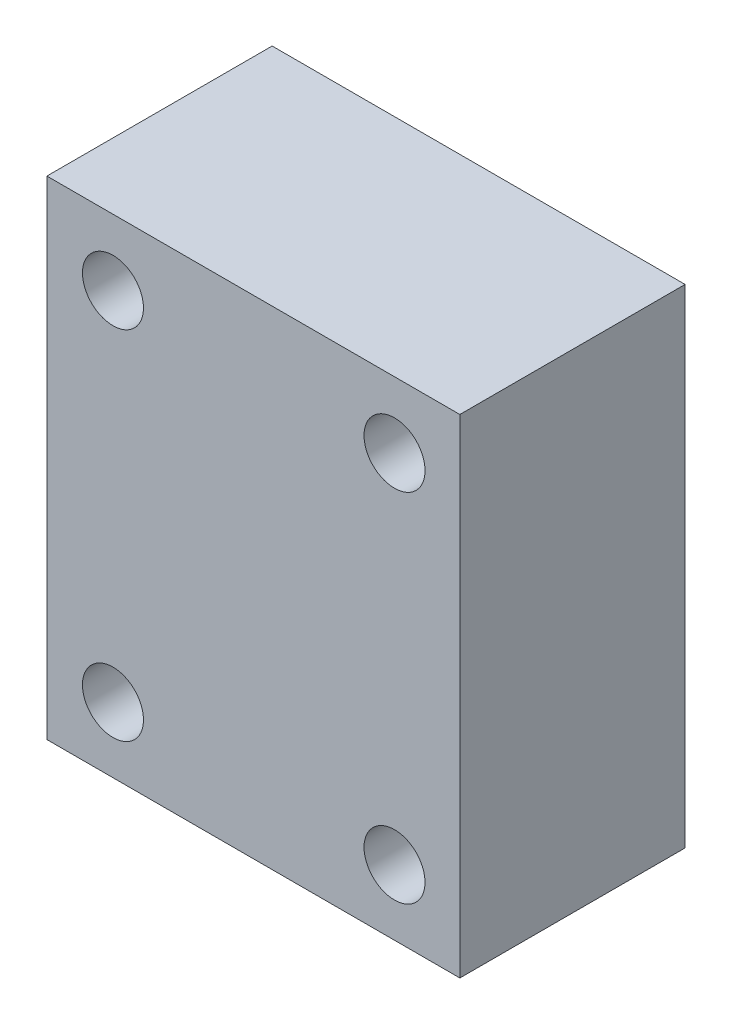
ISO-10303-21;
HEADER;
FILE_DESCRIPTION(('STEP AP214'),'2;1');
FILE_NAME('part.step','',(''),(''),'','','');
FILE_SCHEMA(('AUTOMOTIVE_DESIGN { 1 0 10303 214 1 1 1 1 }'));
ENDSEC;
DATA;
#1=APPLICATION_CONTEXT('core data for automotive mechanical design processes');
#2=APPLICATION_PROTOCOL_DEFINITION('international standard','automotive_design',2000,#1);
#3=PRODUCT_CONTEXT('',#1,'mechanical');
#4=PRODUCT('Part','Part','',(#3));
#5=PRODUCT_RELATED_PRODUCT_CATEGORY('part','',(#4));
#6=PRODUCT_DEFINITION_FORMATION('','',#4);
#7=PRODUCT_DEFINITION_CONTEXT('part definition',#1,'design');
#8=PRODUCT_DEFINITION('design','',#6,#7);
#9=PRODUCT_DEFINITION_SHAPE('','',#8);
#10=(LENGTH_UNIT() NAMED_UNIT(*) SI_UNIT(.MILLI.,.METRE.));
#11=(NAMED_UNIT(*) PLANE_ANGLE_UNIT() SI_UNIT($,.RADIAN.));
#12=(NAMED_UNIT(*) SI_UNIT($,.STERADIAN.) SOLID_ANGLE_UNIT());
#13=UNCERTAINTY_MEASURE_WITH_UNIT(LENGTH_MEASURE(1.E-05),#10,'distance_accuracy_value','');
#14=(GEOMETRIC_REPRESENTATION_CONTEXT(3) GLOBAL_UNCERTAINTY_ASSIGNED_CONTEXT((#13)) GLOBAL_UNIT_ASSIGNED_CONTEXT((#10,
#11,#12)) REPRESENTATION_CONTEXT('',''));
#15=CARTESIAN_POINT('',(0.,0.,0.));
#16=DIRECTION('',(0.,0.,1.));
#17=DIRECTION('',(1.,0.,0.));
#18=AXIS2_PLACEMENT_3D('',#15,#16,#17);
#19=CARTESIAN_POINT('',(34.925,41.275,19.05));
#20=DIRECTION('',(0.,-1.,0.));
#21=DIRECTION('',(0.,0.,-1.));
#22=AXIS2_PLACEMENT_3D('',#19,#20,#21);
#23=PLANE('',#22);
#24=DIRECTION('',(-1.,0.,0.));
#25=VECTOR('',#24,1.);
#26=CARTESIAN_POINT('',(34.925,41.275,-19.05));
#27=LINE('',#26,#25);
#28=CARTESIAN_POINT('',(34.925,41.275,-19.05));
#29=VERTEX_POINT('',#28);
#30=CARTESIAN_POINT('',(-34.925,41.275,-19.05));
#31=VERTEX_POINT('',#30);
#32=EDGE_CURVE('E109',#29,#31,#27,.T.);
#33=ORIENTED_EDGE('',*,*,#32,.T.);
#34=DIRECTION('',(0.,0.,-1.));
#35=VECTOR('',#34,1.);
#36=CARTESIAN_POINT('',(-34.925,41.275,19.05));
#37=LINE('',#36,#35);
#38=CARTESIAN_POINT('',(-34.925,41.275,19.05));
#39=VERTEX_POINT('',#38);
#40=EDGE_CURVE('E11',#39,#31,#37,.T.);
#41=ORIENTED_EDGE('',*,*,#40,.F.);
#42=DIRECTION('',(-1.,0.,0.));
#43=VECTOR('',#42,1.);
#44=CARTESIAN_POINT('',(34.925,41.275,19.05));
#45=LINE('',#44,#43);
#46=CARTESIAN_POINT('',(34.925,41.275,19.05));
#47=VERTEX_POINT('',#46);
#48=EDGE_CURVE('E96',#47,#39,#45,.T.);
#49=ORIENTED_EDGE('',*,*,#48,.F.);
#50=DIRECTION('',(0.,0.,-1.));
#51=VECTOR('',#50,1.);
#52=CARTESIAN_POINT('',(34.925,41.275,19.05));
#53=LINE('',#52,#51);
#54=EDGE_CURVE('E105',#47,#29,#53,.T.);
#55=ORIENTED_EDGE('',*,*,#54,.T.);
#56=EDGE_LOOP('',(#33,#41,#49,#55));
#57=FACE_BOUND('',#56,.T.);
#58=ADVANCED_FACE('F43',(#57),#23,.F.);
#59=CARTESIAN_POINT('',(-34.925,-41.275,19.05));
#60=DIRECTION('',(1.,0.,0.));
#61=DIRECTION('',(0.,0.,-1.));
#62=AXIS2_PLACEMENT_3D('',#59,#60,#61);
#63=PLANE('',#62);
#64=DIRECTION('',(0.,-1.,0.));
#65=VECTOR('',#64,1.);
#66=CARTESIAN_POINT('',(-34.925,-41.275,-19.05));
#67=LINE('',#66,#65);
#68=CARTESIAN_POINT('',(-34.925,-41.275,-19.05));
#69=VERTEX_POINT('',#68);
#70=EDGE_CURVE('E100',#31,#69,#67,.T.);
#71=ORIENTED_EDGE('',*,*,#70,.T.);
#72=DIRECTION('',(0.,0.,-1.));
#73=VECTOR('',#72,1.);
#74=CARTESIAN_POINT('',(-34.925,-41.275,19.05));
#75=LINE('',#74,#73);
#76=CARTESIAN_POINT('',(-34.925,-41.275,19.05));
#77=VERTEX_POINT('',#76);
#78=EDGE_CURVE('E52',#77,#69,#75,.T.);
#79=ORIENTED_EDGE('',*,*,#78,.F.);
#80=DIRECTION('',(0.,-1.,0.));
#81=VECTOR('',#80,1.);
#82=CARTESIAN_POINT('',(-34.925,-41.275,19.05));
#83=LINE('',#82,#81);
#84=EDGE_CURVE('E91',#39,#77,#83,.T.);
#85=ORIENTED_EDGE('',*,*,#84,.F.);
#86=ORIENTED_EDGE('',*,*,#40,.T.);
#87=EDGE_LOOP('',(#71,#79,#85,#86));
#88=FACE_BOUND('',#87,.T.);
#89=ADVANCED_FACE('F99',(#88),#63,.F.);
#90=CARTESIAN_POINT('',(34.925,-41.275,19.05));
#91=DIRECTION('',(0.,1.,0.));
#92=DIRECTION('',(0.,0.,1.));
#93=AXIS2_PLACEMENT_3D('',#90,#91,#92);
#94=PLANE('',#93);
#95=DIRECTION('',(1.,0.,0.));
#96=VECTOR('',#95,1.);
#97=CARTESIAN_POINT('',(34.925,-41.275,-19.05));
#98=LINE('',#97,#96);
#99=CARTESIAN_POINT('',(34.925,-41.275,-19.05));
#100=VERTEX_POINT('',#99);
#101=EDGE_CURVE('E78',#69,#100,#98,.T.);
#102=ORIENTED_EDGE('',*,*,#101,.T.);
#103=DIRECTION('',(0.,0.,-1.));
#104=VECTOR('',#103,1.);
#105=CARTESIAN_POINT('',(34.925,-41.275,19.05));
#106=LINE('',#105,#104);
#107=CARTESIAN_POINT('',(34.925,-41.275,19.05));
#108=VERTEX_POINT('',#107);
#109=EDGE_CURVE('E101',#108,#100,#106,.T.);
#110=ORIENTED_EDGE('',*,*,#109,.F.);
#111=DIRECTION('',(1.,0.,0.));
#112=VECTOR('',#111,1.);
#113=CARTESIAN_POINT('',(34.925,-41.275,19.05));
#114=LINE('',#113,#112);
#115=EDGE_CURVE('E94',#77,#108,#114,.T.);
#116=ORIENTED_EDGE('',*,*,#115,.F.);
#117=ORIENTED_EDGE('',*,*,#78,.T.);
#118=EDGE_LOOP('',(#102,#110,#116,#117));
#119=FACE_BOUND('',#118,.T.);
#120=ADVANCED_FACE('F103',(#119),#94,.F.);
#121=CARTESIAN_POINT('',(34.925,-41.275,19.05));
#122=DIRECTION('',(-1.,0.,0.));
#123=DIRECTION('',(0.,0.,1.));
#124=AXIS2_PLACEMENT_3D('',#121,#122,#123);
#125=PLANE('',#124);
#126=DIRECTION('',(0.,1.,0.));
#127=VECTOR('',#126,1.);
#128=CARTESIAN_POINT('',(34.925,-41.275,-19.05));
#129=LINE('',#128,#127);
#130=EDGE_CURVE('E84',#100,#29,#129,.T.);
#131=ORIENTED_EDGE('',*,*,#130,.T.);
#132=ORIENTED_EDGE('',*,*,#54,.F.);
#133=DIRECTION('',(0.,1.,0.));
#134=VECTOR('',#133,1.);
#135=CARTESIAN_POINT('',(34.925,-41.275,19.05));
#136=LINE('',#135,#134);
#137=EDGE_CURVE('E61',#108,#47,#136,.T.);
#138=ORIENTED_EDGE('',*,*,#137,.F.);
#139=ORIENTED_EDGE('',*,*,#109,.T.);
#140=EDGE_LOOP('',(#131,#132,#138,#139));
#141=FACE_BOUND('',#140,.T.);
#142=ADVANCED_FACE('F187',(#141),#125,.F.);
#143=CARTESIAN_POINT('',(0.,0.,19.05));
#144=DIRECTION('',(0.,0.,-1.));
#145=DIRECTION('',(-1.,0.,0.));
#146=AXIS2_PLACEMENT_3D('',#143,#144,#145);
#147=PLANE('',#146);
#148=CARTESIAN_POINT('',(23.876,30.099,19.05));
#149=DIRECTION('',(0.,0.,-1.));
#150=DIRECTION('',(-1.,0.,0.));
#151=AXIS2_PLACEMENT_3D('',#148,#149,#150);
#152=CIRCLE('',#151,5.159375);
#153=CARTESIAN_POINT('',(18.716625,30.099,19.05));
#154=VERTEX_POINT('',#153);
#155=EDGE_CURVE('E141',#154,#154,#152,.T.);
#156=ORIENTED_EDGE('',*,*,#155,.T.);
#157=EDGE_LOOP('',(#156));
#158=FACE_BOUND('',#157,.T.);
#159=CARTESIAN_POINT('',(-23.749,-30.226,19.05));
#160=DIRECTION('',(0.,0.,-1.));
#161=DIRECTION('',(-1.,0.,0.));
#162=AXIS2_PLACEMENT_3D('',#159,#160,#161);
#163=CIRCLE('',#162,5.159375);
#164=CARTESIAN_POINT('',(-28.908375,-30.226,19.05));
#165=VERTEX_POINT('',#164);
#166=EDGE_CURVE('E144',#165,#165,#163,.T.);
#167=ORIENTED_EDGE('',*,*,#166,.T.);
#168=EDGE_LOOP('',(#167));
#169=FACE_BOUND('',#168,.T.);
#170=CARTESIAN_POINT('',(-23.749,30.099,19.05));
#171=DIRECTION('',(0.,0.,-1.));
#172=DIRECTION('',(-1.,0.,0.));
#173=AXIS2_PLACEMENT_3D('',#170,#171,#172);
#174=CIRCLE('',#173,5.159375);
#175=CARTESIAN_POINT('',(-28.908375,30.099,19.05));
#176=VERTEX_POINT('',#175);
#177=EDGE_CURVE('E150',#176,#176,#174,.T.);
#178=ORIENTED_EDGE('',*,*,#177,.T.);
#179=EDGE_LOOP('',(#178));
#180=FACE_BOUND('',#179,.T.);
#181=CARTESIAN_POINT('',(23.876,-30.226,19.05));
#182=DIRECTION('',(0.,0.,-1.));
#183=DIRECTION('',(-1.,0.,0.));
#184=AXIS2_PLACEMENT_3D('',#181,#182,#183);
#185=CIRCLE('',#184,5.159375);
#186=CARTESIAN_POINT('',(18.716625,-30.226,19.05));
#187=VERTEX_POINT('',#186);
#188=EDGE_CURVE('E140',#187,#187,#185,.T.);
#189=ORIENTED_EDGE('',*,*,#188,.T.);
#190=EDGE_LOOP('',(#189));
#191=FACE_BOUND('',#190,.T.);
#192=ORIENTED_EDGE('',*,*,#48,.T.);
#193=ORIENTED_EDGE('',*,*,#84,.T.);
#194=ORIENTED_EDGE('',*,*,#115,.T.);
#195=ORIENTED_EDGE('',*,*,#137,.T.);
#196=EDGE_LOOP('',(#192,#193,#194,#195));
#197=FACE_BOUND('',#196,.T.);
#198=ADVANCED_FACE('F92',(#158,#169,#180,#191,#197),#147,.F.);
#199=CARTESIAN_POINT('',(0.,0.,-19.05));
#200=DIRECTION('',(0.,0.,-1.));
#201=DIRECTION('',(-1.,0.,0.));
#202=AXIS2_PLACEMENT_3D('',#199,#200,#201);
#203=PLANE('',#202);
#204=CARTESIAN_POINT('',(0.,17.399,-19.05));
#205=DIRECTION('',(0.,0.,1.));
#206=DIRECTION('',(1.,0.,0.));
#207=AXIS2_PLACEMENT_3D('',#204,#205,#206);
#208=CIRCLE('',#207,12.7254);
#209=CARTESIAN_POINT('',(12.7254,17.399,-19.05));
#210=VERTEX_POINT('',#209);
#211=EDGE_CURVE('E339',#210,#210,#208,.T.);
#212=ORIENTED_EDGE('',*,*,#211,.T.);
#213=EDGE_LOOP('',(#212));
#214=FACE_BOUND('',#213,.T.);
#215=CARTESIAN_POINT('',(0.,-17.653,-19.05));
#216=DIRECTION('',(0.,0.,1.));
#217=DIRECTION('',(1.,0.,0.));
#218=AXIS2_PLACEMENT_3D('',#215,#216,#217);
#219=CIRCLE('',#218,12.7254);
#220=CARTESIAN_POINT('',(12.7254,-17.653,-19.05));
#221=VERTEX_POINT('',#220);
#222=EDGE_CURVE('E127',#221,#221,#219,.T.);
#223=ORIENTED_EDGE('',*,*,#222,.T.);
#224=EDGE_LOOP('',(#223));
#225=FACE_BOUND('',#224,.T.);
#226=CARTESIAN_POINT('',(23.876,30.099,-19.05));
#227=DIRECTION('',(0.,0.,1.));
#228=DIRECTION('',(1.,0.,0.));
#229=AXIS2_PLACEMENT_3D('',#226,#227,#228);
#230=CIRCLE('',#229,5.159375);
#231=CARTESIAN_POINT('',(29.035375,30.099,-19.05));
#232=VERTEX_POINT('',#231);
#233=EDGE_CURVE('E137',#232,#232,#230,.T.);
#234=ORIENTED_EDGE('',*,*,#233,.T.);
#235=EDGE_LOOP('',(#234));
#236=FACE_BOUND('',#235,.T.);
#237=CARTESIAN_POINT('',(-23.749,-30.226,-19.05));
#238=DIRECTION('',(0.,0.,1.));
#239=DIRECTION('',(1.,0.,0.));
#240=AXIS2_PLACEMENT_3D('',#237,#238,#239);
#241=CIRCLE('',#240,5.159375);
#242=CARTESIAN_POINT('',(-18.589625,-30.226,-19.05));
#243=VERTEX_POINT('',#242);
#244=EDGE_CURVE('E147',#243,#243,#241,.T.);
#245=ORIENTED_EDGE('',*,*,#244,.T.);
#246=EDGE_LOOP('',(#245));
#247=FACE_BOUND('',#246,.T.);
#248=CARTESIAN_POINT('',(-23.749,30.099,-19.05));
#249=DIRECTION('',(0.,0.,1.));
#250=DIRECTION('',(1.,0.,0.));
#251=AXIS2_PLACEMENT_3D('',#248,#249,#250);
#252=CIRCLE('',#251,5.159375);
#253=CARTESIAN_POINT('',(-18.589625,30.099,-19.05));
#254=VERTEX_POINT('',#253);
#255=EDGE_CURVE('E124',#254,#254,#252,.T.);
#256=ORIENTED_EDGE('',*,*,#255,.T.);
#257=EDGE_LOOP('',(#256));
#258=FACE_BOUND('',#257,.T.);
#259=CARTESIAN_POINT('',(23.876,-30.226,-19.05));
#260=DIRECTION('',(0.,0.,1.));
#261=DIRECTION('',(1.,0.,0.));
#262=AXIS2_PLACEMENT_3D('',#259,#260,#261);
#263=CIRCLE('',#262,5.159375);
#264=CARTESIAN_POINT('',(29.035375,-30.226,-19.05));
#265=VERTEX_POINT('',#264);
#266=EDGE_CURVE('E112',#265,#265,#263,.T.);
#267=ORIENTED_EDGE('',*,*,#266,.T.);
#268=EDGE_LOOP('',(#267));
#269=FACE_BOUND('',#268,.T.);
#270=ORIENTED_EDGE('',*,*,#32,.F.);
#271=ORIENTED_EDGE('',*,*,#130,.F.);
#272=ORIENTED_EDGE('',*,*,#101,.F.);
#273=ORIENTED_EDGE('',*,*,#70,.F.);
#274=EDGE_LOOP('',(#270,#271,#272,#273));
#275=FACE_BOUND('',#274,.T.);
#276=ADVANCED_FACE('F164',(#214,#225,#236,#247,#258,#269,#275),#203,.T.);
#277=CARTESIAN_POINT('',(23.876,-30.226,19.051));
#278=DIRECTION('',(0.,0.,-1.));
#279=DIRECTION('',(-1.,0.,0.));
#280=AXIS2_PLACEMENT_3D('',#277,#278,#279);
#281=CYLINDRICAL_SURFACE('',#280,5.159375);
#282=ORIENTED_EDGE('',*,*,#266,.F.);
#283=EDGE_LOOP('',(#282));
#284=FACE_BOUND('',#283,.T.);
#285=ORIENTED_EDGE('',*,*,#188,.F.);
#286=EDGE_LOOP('',(#285));
#287=FACE_BOUND('',#286,.T.);
#288=ADVANCED_FACE('F161',(#284,#287),#281,.F.);
#289=CARTESIAN_POINT('',(-23.749,30.099,19.051));
#290=DIRECTION('',(0.,0.,-1.));
#291=DIRECTION('',(-1.,0.,0.));
#292=AXIS2_PLACEMENT_3D('',#289,#290,#291);
#293=CYLINDRICAL_SURFACE('',#292,5.159375);
#294=ORIENTED_EDGE('',*,*,#255,.F.);
#295=EDGE_LOOP('',(#294));
#296=FACE_BOUND('',#295,.T.);
#297=ORIENTED_EDGE('',*,*,#177,.F.);
#298=EDGE_LOOP('',(#297));
#299=FACE_BOUND('',#298,.T.);
#300=ADVANCED_FACE('F163',(#296,#299),#293,.F.);
#301=CARTESIAN_POINT('',(-23.749,-30.226,19.051));
#302=DIRECTION('',(0.,0.,-1.));
#303=DIRECTION('',(-1.,0.,0.));
#304=AXIS2_PLACEMENT_3D('',#301,#302,#303);
#305=CYLINDRICAL_SURFACE('',#304,5.159375);
#306=ORIENTED_EDGE('',*,*,#244,.F.);
#307=EDGE_LOOP('',(#306));
#308=FACE_BOUND('',#307,.T.);
#309=ORIENTED_EDGE('',*,*,#166,.F.);
#310=EDGE_LOOP('',(#309));
#311=FACE_BOUND('',#310,.T.);
#312=ADVANCED_FACE('F172',(#308,#311),#305,.F.);
#313=CARTESIAN_POINT('',(23.876,30.099,19.051));
#314=DIRECTION('',(0.,0.,-1.));
#315=DIRECTION('',(-1.,0.,0.));
#316=AXIS2_PLACEMENT_3D('',#313,#314,#315);
#317=CYLINDRICAL_SURFACE('',#316,5.159375);
#318=ORIENTED_EDGE('',*,*,#233,.F.);
#319=EDGE_LOOP('',(#318));
#320=FACE_BOUND('',#319,.T.);
#321=ORIENTED_EDGE('',*,*,#155,.F.);
#322=EDGE_LOOP('',(#321));
#323=FACE_BOUND('',#322,.T.);
#324=ADVANCED_FACE('F238',(#320,#323),#317,.F.);
#325=CARTESIAN_POINT('',(0.,-17.653,-16.2306));
#326=DIRECTION('',(0.,0.,-1.));
#327=DIRECTION('',(-1.,0.,0.));
#328=AXIS2_PLACEMENT_3D('',#325,#326,#327);
#329=CYLINDRICAL_SURFACE('',#328,12.7254);
#330=CARTESIAN_POINT('',(0.,-17.653,-16.2306));
#331=DIRECTION('',(0.,0.,1.));
#332=DIRECTION('',(1.,0.,0.));
#333=AXIS2_PLACEMENT_3D('',#330,#331,#332);
#334=CIRCLE('',#333,12.7254);
#335=CARTESIAN_POINT('',(12.7254,-17.653,-16.2306));
#336=VERTEX_POINT('',#335);
#337=EDGE_CURVE('E120',#336,#336,#334,.T.);
#338=ORIENTED_EDGE('',*,*,#337,.T.);
#339=EDGE_LOOP('',(#338));
#340=FACE_BOUND('',#339,.T.);
#341=ORIENTED_EDGE('',*,*,#222,.F.);
#342=EDGE_LOOP('',(#341));
#343=FACE_BOUND('',#342,.T.);
#344=ADVANCED_FACE('F247',(#340,#343),#329,.F.);
#345=CARTESIAN_POINT('',(0.,-17.653,-16.2306));
#346=DIRECTION('',(0.,0.,1.));
#347=DIRECTION('',(1.,0.,0.));
#348=AXIS2_PLACEMENT_3D('',#345,#346,#347);
#349=PLANE('',#348);
#350=CARTESIAN_POINT('',(0.,-17.653,-16.2306));
#351=DIRECTION('',(0.,0.,1.));
#352=DIRECTION('',(1.,0.,0.));
#353=AXIS2_PLACEMENT_3D('',#350,#351,#352);
#354=CIRCLE('',#353,7.3421875);
#355=CARTESIAN_POINT('',(7.3421875,-17.653,-16.2306));
#356=VERTEX_POINT('',#355);
#357=EDGE_CURVE('E117',#356,#356,#354,.T.);
#358=ORIENTED_EDGE('',*,*,#357,.T.);
#359=EDGE_LOOP('',(#358));
#360=FACE_BOUND('',#359,.T.);
#361=ORIENTED_EDGE('',*,*,#337,.F.);
#362=EDGE_LOOP('',(#361));
#363=FACE_BOUND('',#362,.T.);
#364=ADVANCED_FACE('F267',(#360,#363),#349,.F.);
#365=CARTESIAN_POINT('',(0.,-17.653,9.398));
#366=DIRECTION('',(0.,0.,1.));
#367=DIRECTION('',(1.,0.,0.));
#368=AXIS2_PLACEMENT_3D('',#365,#366,#367);
#369=PLANE('',#368);
#370=CARTESIAN_POINT('',(0.,-17.653,9.398));
#371=DIRECTION('',(0.,0.,1.));
#372=DIRECTION('',(1.,0.,0.));
#373=AXIS2_PLACEMENT_3D('',#370,#371,#372);
#374=CIRCLE('',#373,7.3421875);
#375=CARTESIAN_POINT('',(7.3421875,-17.653,9.398));
#376=VERTEX_POINT('',#375);
#377=EDGE_CURVE('E119',#376,#376,#374,.T.);
#378=ORIENTED_EDGE('',*,*,#377,.F.);
#379=EDGE_LOOP('',(#378));
#380=FACE_BOUND('',#379,.T.);
#381=ADVANCED_FACE('F258',(#380),#369,.F.);
#382=CARTESIAN_POINT('',(0.,-17.653,9.398));
#383=DIRECTION('',(0.,0.,-1.));
#384=DIRECTION('',(-1.,0.,0.));
#385=AXIS2_PLACEMENT_3D('',#382,#383,#384);
#386=CYLINDRICAL_SURFACE('',#385,7.3421875);
#387=ORIENTED_EDGE('',*,*,#357,.F.);
#388=EDGE_LOOP('',(#387));
#389=FACE_BOUND('',#388,.T.);
#390=ORIENTED_EDGE('',*,*,#377,.T.);
#391=EDGE_LOOP('',(#390));
#392=FACE_BOUND('',#391,.T.);
#393=ADVANCED_FACE('F253',(#389,#392),#386,.F.);
#394=CARTESIAN_POINT('',(0.,17.399,-16.2306));
#395=DIRECTION('',(0.,0.,-1.));
#396=DIRECTION('',(-1.,0.,0.));
#397=AXIS2_PLACEMENT_3D('',#394,#395,#396);
#398=CYLINDRICAL_SURFACE('',#397,12.7254);
#399=CARTESIAN_POINT('',(0.,17.399,-16.2306));
#400=DIRECTION('',(0.,0.,1.));
#401=DIRECTION('',(1.,0.,0.));
#402=AXIS2_PLACEMENT_3D('',#399,#400,#401);
#403=CIRCLE('',#402,12.7254);
#404=CARTESIAN_POINT('',(12.7254,17.399,-16.2306));
#405=VERTEX_POINT('',#404);
#406=EDGE_CURVE('E338',#405,#405,#403,.T.);
#407=ORIENTED_EDGE('',*,*,#406,.T.);
#408=EDGE_LOOP('',(#407));
#409=FACE_BOUND('',#408,.T.);
#410=ORIENTED_EDGE('',*,*,#211,.F.);
#411=EDGE_LOOP('',(#410));
#412=FACE_BOUND('',#411,.T.);
#413=ADVANCED_FACE('F257',(#409,#412),#398,.F.);
#414=CARTESIAN_POINT('',(0.,17.399,-16.2306));
#415=DIRECTION('',(0.,0.,1.));
#416=DIRECTION('',(1.,0.,0.));
#417=AXIS2_PLACEMENT_3D('',#414,#415,#416);
#418=PLANE('',#417);
#419=CARTESIAN_POINT('',(0.,17.399,-16.2306));
#420=DIRECTION('',(0.,0.,1.));
#421=DIRECTION('',(1.,0.,0.));
#422=AXIS2_PLACEMENT_3D('',#419,#420,#421);
#423=CIRCLE('',#422,7.3421875);
#424=CARTESIAN_POINT('',(7.3421875,17.399,-16.2306));
#425=VERTEX_POINT('',#424);
#426=EDGE_CURVE('E46',#425,#425,#423,.T.);
#427=ORIENTED_EDGE('',*,*,#426,.T.);
#428=EDGE_LOOP('',(#427));
#429=FACE_BOUND('',#428,.T.);
#430=ORIENTED_EDGE('',*,*,#406,.F.);
#431=EDGE_LOOP('',(#430));
#432=FACE_BOUND('',#431,.T.);
#433=ADVANCED_FACE('F300',(#429,#432),#418,.F.);
#434=CARTESIAN_POINT('',(0.,17.399,9.398));
#435=DIRECTION('',(0.,0.,1.));
#436=DIRECTION('',(1.,0.,0.));
#437=AXIS2_PLACEMENT_3D('',#434,#435,#436);
#438=PLANE('',#437);
#439=CARTESIAN_POINT('',(0.,17.399,9.398));
#440=DIRECTION('',(0.,0.,1.));
#441=DIRECTION('',(1.,0.,0.));
#442=AXIS2_PLACEMENT_3D('',#439,#440,#441);
#443=CIRCLE('',#442,7.3421875);
#444=CARTESIAN_POINT('',(7.3421875,17.399,9.398));
#445=VERTEX_POINT('',#444);
#446=EDGE_CURVE('E132',#445,#445,#443,.T.);
#447=ORIENTED_EDGE('',*,*,#446,.F.);
#448=EDGE_LOOP('',(#447));
#449=FACE_BOUND('',#448,.T.);
#450=ADVANCED_FACE('F291',(#449),#438,.F.);
#451=CARTESIAN_POINT('',(0.,17.399,9.398));
#452=DIRECTION('',(0.,0.,-1.));
#453=DIRECTION('',(-1.,0.,0.));
#454=AXIS2_PLACEMENT_3D('',#451,#452,#453);
#455=CYLINDRICAL_SURFACE('',#454,7.3421875);
#456=ORIENTED_EDGE('',*,*,#426,.F.);
#457=EDGE_LOOP('',(#456));
#458=FACE_BOUND('',#457,.T.);
#459=ORIENTED_EDGE('',*,*,#446,.T.);
#460=EDGE_LOOP('',(#459));
#461=FACE_BOUND('',#460,.T.);
#462=ADVANCED_FACE('F287',(#458,#461),#455,.F.);
#463=CLOSED_SHELL('',(#58,#89,#120,#142,#198,#276,#288,#300,#312,#324,#344,#364,#381,#393,#413,
#433,#450,#462));
#464=MANIFOLD_SOLID_BREP('B2',#463);
#465=ADVANCED_BREP_SHAPE_REPRESENTATION('',(#18,#464),#14);
#466=SHAPE_DEFINITION_REPRESENTATION(#9,#465);
ENDSEC;
END-ISO-10303-21;
